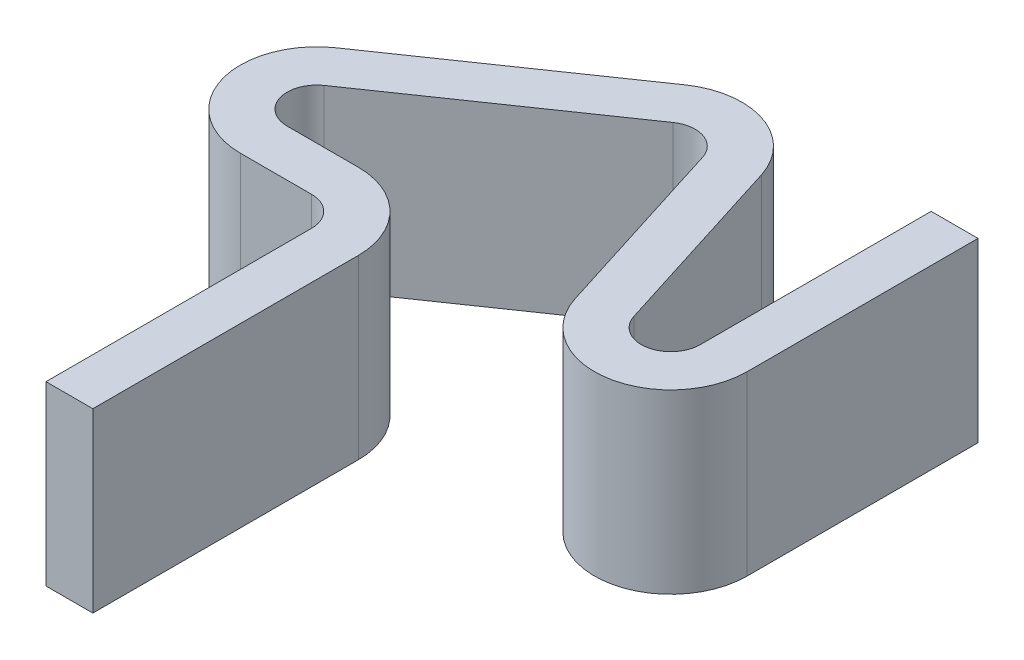
ISO-10303-21;
HEADER;
FILE_DESCRIPTION(('STEP AP214'),'2;1');
FILE_NAME('part.step','',(''),(''),'','','');
FILE_SCHEMA(('AUTOMOTIVE_DESIGN { 1 0 10303 214 1 1 1 1 }'));
ENDSEC;
DATA;
#1=APPLICATION_CONTEXT('core data for automotive mechanical design processes');
#2=APPLICATION_PROTOCOL_DEFINITION('international standard','automotive_design',2000,#1);
#3=PRODUCT_CONTEXT('',#1,'mechanical');
#4=PRODUCT('Part','Part','',(#3));
#5=PRODUCT_RELATED_PRODUCT_CATEGORY('part','',(#4));
#6=PRODUCT_DEFINITION_FORMATION('','',#4);
#7=PRODUCT_DEFINITION_CONTEXT('part definition',#1,'design');
#8=PRODUCT_DEFINITION('design','',#6,#7);
#9=PRODUCT_DEFINITION_SHAPE('','',#8);
#10=(LENGTH_UNIT() NAMED_UNIT(*) SI_UNIT(.MILLI.,.METRE.));
#11=(NAMED_UNIT(*) PLANE_ANGLE_UNIT() SI_UNIT($,.RADIAN.));
#12=(NAMED_UNIT(*) SI_UNIT($,.STERADIAN.) SOLID_ANGLE_UNIT());
#13=UNCERTAINTY_MEASURE_WITH_UNIT(LENGTH_MEASURE(1.E-05),#10,'distance_accuracy_value','');
#14=(GEOMETRIC_REPRESENTATION_CONTEXT(3) GLOBAL_UNCERTAINTY_ASSIGNED_CONTEXT((#13)) GLOBAL_UNIT_ASSIGNED_CONTEXT((#10,
#11,#12)) REPRESENTATION_CONTEXT('',''));
#15=CARTESIAN_POINT('',(0.,0.,0.));
#16=DIRECTION('',(0.,0.,1.));
#17=DIRECTION('',(1.,0.,0.));
#18=AXIS2_PLACEMENT_3D('',#15,#16,#17);
#19=CARTESIAN_POINT('',(0.,1.5,0.));
#20=DIRECTION('',(0.,-1.,0.));
#21=DIRECTION('',(0.,0.,-1.));
#22=AXIS2_PLACEMENT_3D('',#19,#20,#21);
#23=CYLINDRICAL_SURFACE('',#22,1.29375);
#24=CARTESIAN_POINT('',(0.,-1.5,0.));
#25=DIRECTION('',(0.,1.,0.));
#26=DIRECTION('',(0.,0.,1.));
#27=AXIS2_PLACEMENT_3D('',#24,#25,#26);
#28=CIRCLE('',#27,1.29375);
#29=CARTESIAN_POINT('',(1.29375,-1.5,0.));
#30=VERTEX_POINT('',#29);
#31=CARTESIAN_POINT('',(0.,-1.5,-1.29375));
#32=VERTEX_POINT('',#31);
#33=EDGE_CURVE('E212',#30,#32,#28,.T.);
#34=ORIENTED_EDGE('',*,*,#33,.T.);
#35=DIRECTION('',(0.,-1.,0.));
#36=VECTOR('',#35,1.);
#37=CARTESIAN_POINT('',(0.,1.5,-1.29375));
#38=LINE('',#37,#36);
#39=CARTESIAN_POINT('',(0.,1.5,-1.29375));
#40=VERTEX_POINT('',#39);
#41=EDGE_CURVE('E11',#40,#32,#38,.T.);
#42=ORIENTED_EDGE('',*,*,#41,.F.);
#43=CARTESIAN_POINT('',(0.,1.5,0.));
#44=DIRECTION('',(0.,1.,0.));
#45=DIRECTION('',(0.,0.,1.));
#46=AXIS2_PLACEMENT_3D('',#43,#44,#45);
#47=CIRCLE('',#46,1.29375);
#48=CARTESIAN_POINT('',(1.29375,1.5,0.));
#49=VERTEX_POINT('',#48);
#50=EDGE_CURVE('E270',#49,#40,#47,.T.);
#51=ORIENTED_EDGE('',*,*,#50,.F.);
#52=DIRECTION('',(0.,-1.,0.));
#53=VECTOR('',#52,1.);
#54=CARTESIAN_POINT('',(1.29375,1.5,0.));
#55=LINE('',#54,#53);
#56=EDGE_CURVE('E208',#49,#30,#55,.T.);
#57=ORIENTED_EDGE('',*,*,#56,.T.);
#58=EDGE_LOOP('',(#34,#42,#51,#57));
#59=FACE_BOUND('',#58,.T.);
#60=ADVANCED_FACE('F39',(#59),#23,.T.);
#61=CARTESIAN_POINT('',(0.,1.5,-1.29375));
#62=DIRECTION('',(0.,0.,1.));
#63=DIRECTION('',(1.,0.,0.));
#64=AXIS2_PLACEMENT_3D('',#61,#62,#63);
#65=PLANE('',#64);
#66=DIRECTION('',(-1.,0.,0.));
#67=VECTOR('',#66,1.);
#68=CARTESIAN_POINT('',(0.,-1.5,-1.29375));
#69=LINE('',#68,#67);
#70=CARTESIAN_POINT('',(-1.20625,-1.5,-1.29375));
#71=VERTEX_POINT('',#70);
#72=EDGE_CURVE('E216',#32,#71,#69,.T.);
#73=ORIENTED_EDGE('',*,*,#72,.T.);
#74=DIRECTION('',(0.,-1.,0.));
#75=VECTOR('',#74,1.);
#76=CARTESIAN_POINT('',(-1.20625,1.5,-1.29375));
#77=LINE('',#76,#75);
#78=CARTESIAN_POINT('',(-1.20625,1.5,-1.29375));
#79=VERTEX_POINT('',#78);
#80=EDGE_CURVE('E48',#79,#71,#77,.T.);
#81=ORIENTED_EDGE('',*,*,#80,.F.);
#82=DIRECTION('',(-1.,0.,0.));
#83=VECTOR('',#82,1.);
#84=CARTESIAN_POINT('',(0.,1.5,-1.29375));
#85=LINE('',#84,#83);
#86=EDGE_CURVE('E135',#40,#79,#85,.T.);
#87=ORIENTED_EDGE('',*,*,#86,.F.);
#88=ORIENTED_EDGE('',*,*,#41,.T.);
#89=EDGE_LOOP('',(#73,#81,#87,#88));
#90=FACE_BOUND('',#89,.T.);
#91=ADVANCED_FACE('F420',(#90),#65,.F.);
#92=CARTESIAN_POINT('',(-1.20625,1.5,-1.79375));
#93=DIRECTION('',(0.,-1.,0.));
#94=DIRECTION('',(0.,0.,-1.));
#95=AXIS2_PLACEMENT_3D('',#92,#93,#94);
#96=CYLINDRICAL_SURFACE('',#95,0.5);
#97=CARTESIAN_POINT('',(-1.20625,-1.5,-1.79375));
#98=DIRECTION('',(0.,-1.,0.));
#99=DIRECTION('',(0.,0.,-1.));
#100=AXIS2_PLACEMENT_3D('',#97,#98,#99);
#101=CIRCLE('',#100,0.5);
#102=CARTESIAN_POINT('',(-1.49001339561737,-1.5,-2.20542746514438));
#103=VERTEX_POINT('',#102);
#104=EDGE_CURVE('E219',#71,#103,#101,.T.);
#105=ORIENTED_EDGE('',*,*,#104,.T.);
#106=DIRECTION('',(0.,-1.,0.));
#107=VECTOR('',#106,1.);
#108=CARTESIAN_POINT('',(-1.49001339561737,1.5,-2.20542746514438));
#109=LINE('',#108,#107);
#110=CARTESIAN_POINT('',(-1.49001339561737,1.5,-2.20542746514438));
#111=VERTEX_POINT('',#110);
#112=EDGE_CURVE('E329',#111,#103,#109,.T.);
#113=ORIENTED_EDGE('',*,*,#112,.F.);
#114=CARTESIAN_POINT('',(-1.20625,1.5,-1.79375));
#115=DIRECTION('',(0.,-1.,0.));
#116=DIRECTION('',(0.,0.,-1.));
#117=AXIS2_PLACEMENT_3D('',#114,#115,#116);
#118=CIRCLE('',#117,0.5);
#119=EDGE_CURVE('E339',#79,#111,#118,.T.);
#120=ORIENTED_EDGE('',*,*,#119,.F.);
#121=ORIENTED_EDGE('',*,*,#80,.T.);
#122=EDGE_LOOP('',(#105,#113,#120,#121));
#123=FACE_BOUND('',#122,.T.);
#124=ADVANCED_FACE('F337',(#123),#96,.F.);
#125=CARTESIAN_POINT('',(-1.49001339561737,1.5,-2.20542746514438));
#126=DIRECTION('',(-0.567526791234746,0.,-0.82335493028875));
#127=DIRECTION('',(-0.82335493028875,0.,0.567526791234746));
#128=AXIS2_PLACEMENT_3D('',#125,#126,#127);
#129=PLANE('',#128);
#130=DIRECTION('',(0.82335493028875,0.,-0.567526791234746));
#131=VECTOR('',#130,1.);
#132=CARTESIAN_POINT('',(-1.49001339561737,-1.5,-2.20542746514438));
#133=LINE('',#132,#131);
#134=CARTESIAN_POINT('',(2.00998660438263,-1.5,-4.61792746514438));
#135=VERTEX_POINT('',#134);
#136=EDGE_CURVE('E222',#103,#135,#133,.T.);
#137=ORIENTED_EDGE('',*,*,#136,.T.);
#138=DIRECTION('',(0.,-1.,0.));
#139=VECTOR('',#138,1.);
#140=CARTESIAN_POINT('',(2.00998660438263,1.5,-4.61792746514438));
#141=LINE('',#140,#139);
#142=CARTESIAN_POINT('',(2.00998660438263,1.5,-4.61792746514438));
#143=VERTEX_POINT('',#142);
#144=EDGE_CURVE('E325',#143,#135,#141,.T.);
#145=ORIENTED_EDGE('',*,*,#144,.F.);
#146=DIRECTION('',(0.82335493028875,0.,-0.567526791234746));
#147=VECTOR('',#146,1.);
#148=CARTESIAN_POINT('',(-1.49001339561737,1.5,-2.20542746514438));
#149=LINE('',#148,#147);
#150=EDGE_CURVE('E358',#111,#143,#149,.T.);
#151=ORIENTED_EDGE('',*,*,#150,.F.);
#152=ORIENTED_EDGE('',*,*,#112,.T.);
#153=EDGE_LOOP('',(#137,#145,#151,#152));
#154=FACE_BOUND('',#153,.T.);
#155=ADVANCED_FACE('F348',(#154),#129,.F.);
#156=CARTESIAN_POINT('',(2.29375,1.5,-4.20625));
#157=DIRECTION('',(0.,-1.,0.));
#158=DIRECTION('',(0.,0.,-1.));
#159=AXIS2_PLACEMENT_3D('',#156,#157,#158);
#160=CYLINDRICAL_SURFACE('',#159,0.500000000000001);
#161=CARTESIAN_POINT('',(2.29375,-1.5,-4.20625));
#162=DIRECTION('',(0.,-1.,0.));
#163=DIRECTION('',(0.,0.,-1.));
#164=AXIS2_PLACEMENT_3D('',#161,#162,#163);
#165=CIRCLE('',#164,0.500000000000001);
#166=CARTESIAN_POINT('',(2.77058189966681,-1.5,-4.35668716116752));
#167=VERTEX_POINT('',#166);
#168=EDGE_CURVE('E225',#135,#167,#165,.T.);
#169=ORIENTED_EDGE('',*,*,#168,.T.);
#170=DIRECTION('',(0.,-1.,0.));
#171=VECTOR('',#170,1.);
#172=CARTESIAN_POINT('',(2.77058189966681,1.5,-4.35668716116752));
#173=LINE('',#172,#171);
#174=CARTESIAN_POINT('',(2.77058189966681,1.5,-4.35668716116752));
#175=VERTEX_POINT('',#174);
#176=EDGE_CURVE('E321',#175,#167,#173,.T.);
#177=ORIENTED_EDGE('',*,*,#176,.F.);
#178=CARTESIAN_POINT('',(2.29375,1.5,-4.20625));
#179=DIRECTION('',(0.,-1.,0.));
#180=DIRECTION('',(0.,0.,-1.));
#181=AXIS2_PLACEMENT_3D('',#178,#179,#180);
#182=CIRCLE('',#181,0.500000000000001);
#183=EDGE_CURVE('E354',#143,#175,#182,.T.);
#184=ORIENTED_EDGE('',*,*,#183,.F.);
#185=ORIENTED_EDGE('',*,*,#144,.T.);
#186=EDGE_LOOP('',(#169,#177,#184,#185));
#187=FACE_BOUND('',#186,.T.);
#188=ADVANCED_FACE('F352',(#187),#160,.F.);
#189=CARTESIAN_POINT('',(2.77058189966681,1.5,-4.35668716116752));
#190=DIRECTION('',(0.953663799333616,0.,-0.300874322335046));
#191=DIRECTION('',(-0.300874322335046,0.,-0.953663799333616));
#192=AXIS2_PLACEMENT_3D('',#189,#190,#191);
#193=PLANE('',#192);
#194=DIRECTION('',(0.300874322335046,0.,0.953663799333616));
#195=VECTOR('',#194,1.);
#196=CARTESIAN_POINT('',(2.77058189966681,-1.5,-4.35668716116752));
#197=LINE('',#196,#195);
#198=CARTESIAN_POINT('',(3.76704888615141,-1.5,-1.19824384547904));
#199=VERTEX_POINT('',#198);
#200=EDGE_CURVE('E228',#167,#199,#197,.T.);
#201=ORIENTED_EDGE('',*,*,#200,.T.);
#202=DIRECTION('',(0.,-1.,0.));
#203=VECTOR('',#202,1.);
#204=CARTESIAN_POINT('',(3.76704888615141,1.5,-1.19824384547904));
#205=LINE('',#204,#203);
#206=CARTESIAN_POINT('',(3.76704888615141,1.5,-1.19824384547904));
#207=VERTEX_POINT('',#206);
#208=EDGE_CURVE('E317',#207,#199,#205,.T.);
#209=ORIENTED_EDGE('',*,*,#208,.F.);
#210=DIRECTION('',(0.300874322335046,0.,0.953663799333616));
#211=VECTOR('',#210,1.);
#212=CARTESIAN_POINT('',(2.77058189966681,1.5,-4.35668716116752));
#213=LINE('',#212,#211);
#214=EDGE_CURVE('E357',#175,#207,#213,.T.);
#215=ORIENTED_EDGE('',*,*,#214,.F.);
#216=ORIENTED_EDGE('',*,*,#176,.T.);
#217=EDGE_LOOP('',(#201,#209,#215,#216));
#218=FACE_BOUND('',#217,.T.);
#219=ADVANCED_FACE('F433',(#218),#193,.F.);
#220=CARTESIAN_POINT('',(5.00085142653927,1.5,-1.5875));
#221=DIRECTION('',(0.,-1.,0.));
#222=DIRECTION('',(0.,0.,-1.));
#223=AXIS2_PLACEMENT_3D('',#220,#221,#222);
#224=CYLINDRICAL_SURFACE('',#223,1.29375);
#225=CARTESIAN_POINT('',(5.00085142653927,-1.5,-1.5875));
#226=DIRECTION('',(0.,1.,0.));
#227=DIRECTION('',(0.,0.,1.));
#228=AXIS2_PLACEMENT_3D('',#225,#226,#227);
#229=CIRCLE('',#228,1.29375);
#230=CARTESIAN_POINT('',(6.29460142653927,-1.5,-1.5875));
#231=VERTEX_POINT('',#230);
#232=EDGE_CURVE('E231',#199,#231,#229,.T.);
#233=ORIENTED_EDGE('',*,*,#232,.T.);
#234=DIRECTION('',(0.,-1.,0.));
#235=VECTOR('',#234,1.);
#236=CARTESIAN_POINT('',(6.29460142653927,1.5,-1.5875));
#237=LINE('',#236,#235);
#238=CARTESIAN_POINT('',(6.29460142653927,1.5,-1.5875));
#239=VERTEX_POINT('',#238);
#240=EDGE_CURVE('E313',#239,#231,#237,.T.);
#241=ORIENTED_EDGE('',*,*,#240,.F.);
#242=CARTESIAN_POINT('',(5.00085142653927,1.5,-1.5875));
#243=DIRECTION('',(0.,1.,0.));
#244=DIRECTION('',(0.,0.,1.));
#245=AXIS2_PLACEMENT_3D('',#242,#243,#244);
#246=CIRCLE('',#245,1.29375);
#247=EDGE_CURVE('E362',#207,#239,#246,.T.);
#248=ORIENTED_EDGE('',*,*,#247,.F.);
#249=ORIENTED_EDGE('',*,*,#208,.T.);
#250=EDGE_LOOP('',(#233,#241,#248,#249));
#251=FACE_BOUND('',#250,.T.);
#252=ADVANCED_FACE('F436',(#251),#224,.T.);
#253=CARTESIAN_POINT('',(6.29460142653927,1.5,-1.5875));
#254=DIRECTION('',(-1.,0.,0.));
#255=DIRECTION('',(0.,0.,1.));
#256=AXIS2_PLACEMENT_3D('',#253,#254,#255);
#257=PLANE('',#256);
#258=DIRECTION('',(0.,0.,-1.));
#259=VECTOR('',#258,1.);
#260=CARTESIAN_POINT('',(6.29460142653927,-1.5,-1.5875));
#261=LINE('',#260,#259);
#262=CARTESIAN_POINT('',(6.29460142653928,-1.5,-5.5));
#263=VERTEX_POINT('',#262);
#264=EDGE_CURVE('E234',#231,#263,#261,.T.);
#265=ORIENTED_EDGE('',*,*,#264,.T.);
#266=DIRECTION('',(0.,-1.,0.));
#267=VECTOR('',#266,1.);
#268=CARTESIAN_POINT('',(6.29460142653928,1.5,-5.5));
#269=LINE('',#268,#267);
#270=CARTESIAN_POINT('',(6.29460142653928,1.5,-5.5));
#271=VERTEX_POINT('',#270);
#272=EDGE_CURVE('E309',#271,#263,#269,.T.);
#273=ORIENTED_EDGE('',*,*,#272,.F.);
#274=DIRECTION('',(0.,0.,-1.));
#275=VECTOR('',#274,1.);
#276=CARTESIAN_POINT('',(6.29460142653927,1.5,-1.5875));
#277=LINE('',#276,#275);
#278=EDGE_CURVE('E369',#239,#271,#277,.T.);
#279=ORIENTED_EDGE('',*,*,#278,.F.);
#280=ORIENTED_EDGE('',*,*,#240,.T.);
#281=EDGE_LOOP('',(#265,#273,#279,#280));
#282=FACE_BOUND('',#281,.T.);
#283=ADVANCED_FACE('F440',(#282),#257,.F.);
#284=CARTESIAN_POINT('',(5.50085142653927,1.5,-5.5));
#285=DIRECTION('',(0.,0.,1.));
#286=DIRECTION('',(1.,0.,0.));
#287=AXIS2_PLACEMENT_3D('',#284,#285,#286);
#288=PLANE('',#287);
#289=DIRECTION('',(-1.,0.,0.));
#290=VECTOR('',#289,1.);
#291=CARTESIAN_POINT('',(5.50085142653927,-1.5,-5.5));
#292=LINE('',#291,#290);
#293=CARTESIAN_POINT('',(5.50085142653927,-1.5,-5.5));
#294=VERTEX_POINT('',#293);
#295=EDGE_CURVE('E237',#263,#294,#292,.T.);
#296=ORIENTED_EDGE('',*,*,#295,.T.);
#297=DIRECTION('',(0.,-1.,0.));
#298=VECTOR('',#297,1.);
#299=CARTESIAN_POINT('',(5.50085142653927,1.5,-5.5));
#300=LINE('',#299,#298);
#301=CARTESIAN_POINT('',(5.50085142653927,1.5,-5.5));
#302=VERTEX_POINT('',#301);
#303=EDGE_CURVE('E305',#302,#294,#300,.T.);
#304=ORIENTED_EDGE('',*,*,#303,.F.);
#305=DIRECTION('',(-1.,0.,0.));
#306=VECTOR('',#305,1.);
#307=CARTESIAN_POINT('',(5.50085142653927,1.5,-5.5));
#308=LINE('',#307,#306);
#309=EDGE_CURVE('E372',#271,#302,#308,.T.);
#310=ORIENTED_EDGE('',*,*,#309,.F.);
#311=ORIENTED_EDGE('',*,*,#272,.T.);
#312=EDGE_LOOP('',(#296,#304,#310,#311));
#313=FACE_BOUND('',#312,.T.);
#314=ADVANCED_FACE('F444',(#313),#288,.F.);
#315=CARTESIAN_POINT('',(5.50085142653927,1.5,-1.5875));
#316=DIRECTION('',(1.,0.,0.));
#317=DIRECTION('',(0.,0.,-1.));
#318=AXIS2_PLACEMENT_3D('',#315,#316,#317);
#319=PLANE('',#318);
#320=DIRECTION('',(0.,0.,1.));
#321=VECTOR('',#320,1.);
#322=CARTESIAN_POINT('',(5.50085142653927,-1.5,-1.5875));
#323=LINE('',#322,#321);
#324=CARTESIAN_POINT('',(5.50085142653927,-1.5,-1.5875));
#325=VERTEX_POINT('',#324);
#326=EDGE_CURVE('E240',#294,#325,#323,.T.);
#327=ORIENTED_EDGE('',*,*,#326,.T.);
#328=DIRECTION('',(0.,-1.,0.));
#329=VECTOR('',#328,1.);
#330=CARTESIAN_POINT('',(5.50085142653927,1.5,-1.5875));
#331=LINE('',#330,#329);
#332=CARTESIAN_POINT('',(5.50085142653927,1.5,-1.5875));
#333=VERTEX_POINT('',#332);
#334=EDGE_CURVE('E301',#333,#325,#331,.T.);
#335=ORIENTED_EDGE('',*,*,#334,.F.);
#336=DIRECTION('',(0.,0.,1.));
#337=VECTOR('',#336,1.);
#338=CARTESIAN_POINT('',(5.50085142653927,1.5,-1.5875));
#339=LINE('',#338,#337);
#340=EDGE_CURVE('E375',#302,#333,#339,.T.);
#341=ORIENTED_EDGE('',*,*,#340,.F.);
#342=ORIENTED_EDGE('',*,*,#303,.T.);
#343=EDGE_LOOP('',(#327,#335,#341,#342));
#344=FACE_BOUND('',#343,.T.);
#345=ADVANCED_FACE('F448',(#344),#319,.F.);
#346=CARTESIAN_POINT('',(5.00085142653927,1.5,-1.5875));
#347=DIRECTION('',(0.,-1.,0.));
#348=DIRECTION('',(0.,0.,-1.));
#349=AXIS2_PLACEMENT_3D('',#346,#347,#348);
#350=CYLINDRICAL_SURFACE('',#349,0.500000000000002);
#351=CARTESIAN_POINT('',(5.00085142653927,-1.5,-1.5875));
#352=DIRECTION('',(0.,-1.,0.));
#353=DIRECTION('',(0.,0.,1.));
#354=AXIS2_PLACEMENT_3D('',#351,#352,#353);
#355=CIRCLE('',#354,0.500000000000002);
#356=CARTESIAN_POINT('',(4.52401952687246,-1.5,-1.43706283883248));
#357=VERTEX_POINT('',#356);
#358=EDGE_CURVE('E243',#325,#357,#355,.T.);
#359=ORIENTED_EDGE('',*,*,#358,.T.);
#360=DIRECTION('',(0.,-1.,0.));
#361=VECTOR('',#360,1.);
#362=CARTESIAN_POINT('',(4.52401952687246,1.5,-1.43706283883248));
#363=LINE('',#362,#361);
#364=CARTESIAN_POINT('',(4.52401952687246,1.5,-1.43706283883248));
#365=VERTEX_POINT('',#364);
#366=EDGE_CURVE('E297',#365,#357,#363,.T.);
#367=ORIENTED_EDGE('',*,*,#366,.F.);
#368=CARTESIAN_POINT('',(5.00085142653927,1.5,-1.5875));
#369=DIRECTION('',(0.,-1.,0.));
#370=DIRECTION('',(0.,0.,1.));
#371=AXIS2_PLACEMENT_3D('',#368,#369,#370);
#372=CIRCLE('',#371,0.500000000000002);
#373=EDGE_CURVE('E378',#333,#365,#372,.T.);
#374=ORIENTED_EDGE('',*,*,#373,.F.);
#375=ORIENTED_EDGE('',*,*,#334,.T.);
#376=EDGE_LOOP('',(#359,#367,#374,#375));
#377=FACE_BOUND('',#376,.T.);
#378=ADVANCED_FACE('F452',(#377),#350,.F.);
#379=CARTESIAN_POINT('',(3.52755254038787,1.5,-4.59550615452097));
#380=DIRECTION('',(-0.953663799333616,0.,0.300874322335043));
#381=DIRECTION('',(0.300874322335043,0.,0.953663799333617));
#382=AXIS2_PLACEMENT_3D('',#379,#380,#381);
#383=PLANE('',#382);
#384=DIRECTION('',(-0.300874322335043,0.,-0.953663799333616));
#385=VECTOR('',#384,1.);
#386=CARTESIAN_POINT('',(3.52755254038787,-1.5,-4.59550615452097));
#387=LINE('',#386,#385);
#388=CARTESIAN_POINT('',(3.52755254038787,-1.5,-4.59550615452097));
#389=VERTEX_POINT('',#388);
#390=EDGE_CURVE('E246',#357,#389,#387,.T.);
#391=ORIENTED_EDGE('',*,*,#390,.T.);
#392=DIRECTION('',(0.,-1.,0.));
#393=VECTOR('',#392,1.);
#394=CARTESIAN_POINT('',(3.52755254038787,1.5,-4.59550615452097));
#395=LINE('',#394,#393);
#396=CARTESIAN_POINT('',(3.52755254038787,1.5,-4.59550615452097));
#397=VERTEX_POINT('',#396);
#398=EDGE_CURVE('E293',#397,#389,#395,.T.);
#399=ORIENTED_EDGE('',*,*,#398,.F.);
#400=DIRECTION('',(-0.300874322335043,0.,-0.953663799333616));
#401=VECTOR('',#400,1.);
#402=CARTESIAN_POINT('',(3.52755254038787,1.5,-4.59550615452097));
#403=LINE('',#402,#401);
#404=EDGE_CURVE('E381',#365,#397,#403,.T.);
#405=ORIENTED_EDGE('',*,*,#404,.F.);
#406=ORIENTED_EDGE('',*,*,#366,.T.);
#407=EDGE_LOOP('',(#391,#399,#405,#406));
#408=FACE_BOUND('',#407,.T.);
#409=ADVANCED_FACE('F456',(#408),#383,.F.);
#410=CARTESIAN_POINT('',(2.29375,1.5,-4.20625));
#411=DIRECTION('',(0.,-1.,0.));
#412=DIRECTION('',(0.,0.,-1.));
#413=AXIS2_PLACEMENT_3D('',#410,#411,#412);
#414=CYLINDRICAL_SURFACE('',#413,1.29375);
#415=CARTESIAN_POINT('',(2.29375,-1.5,-4.20625));
#416=DIRECTION('',(0.,1.,0.));
#417=DIRECTION('',(0.,0.,-1.));
#418=AXIS2_PLACEMENT_3D('',#415,#416,#417);
#419=CIRCLE('',#418,1.29375);
#420=CARTESIAN_POINT('',(1.55951221384005,-1.5,-5.27146544106107));
#421=VERTEX_POINT('',#420);
#422=EDGE_CURVE('E249',#389,#421,#419,.T.);
#423=ORIENTED_EDGE('',*,*,#422,.T.);
#424=DIRECTION('',(0.,-1.,0.));
#425=VECTOR('',#424,1.);
#426=CARTESIAN_POINT('',(1.55951221384005,1.5,-5.27146544106107));
#427=LINE('',#426,#425);
#428=CARTESIAN_POINT('',(1.55951221384005,1.5,-5.27146544106107));
#429=VERTEX_POINT('',#428);
#430=EDGE_CURVE('E289',#429,#421,#427,.T.);
#431=ORIENTED_EDGE('',*,*,#430,.F.);
#432=CARTESIAN_POINT('',(2.29375,1.5,-4.20625));
#433=DIRECTION('',(0.,1.,0.));
#434=DIRECTION('',(0.,0.,-1.));
#435=AXIS2_PLACEMENT_3D('',#432,#433,#434);
#436=CIRCLE('',#435,1.29375);
#437=EDGE_CURVE('E384',#397,#429,#436,.T.);
#438=ORIENTED_EDGE('',*,*,#437,.F.);
#439=ORIENTED_EDGE('',*,*,#398,.T.);
#440=EDGE_LOOP('',(#423,#431,#438,#439));
#441=FACE_BOUND('',#440,.T.);
#442=ADVANCED_FACE('F460',(#441),#414,.T.);
#443=CARTESIAN_POINT('',(-1.94048778615995,1.5,-2.85896544106107));
#444=DIRECTION('',(0.567526791234746,0.,0.82335493028875));
#445=DIRECTION('',(0.82335493028875,0.,-0.567526791234746));
#446=AXIS2_PLACEMENT_3D('',#443,#444,#445);
#447=PLANE('',#446);
#448=DIRECTION('',(-0.82335493028875,0.,0.567526791234746));
#449=VECTOR('',#448,1.);
#450=CARTESIAN_POINT('',(-1.94048778615995,-1.5,-2.85896544106107));
#451=LINE('',#450,#449);
#452=CARTESIAN_POINT('',(-1.94048778615995,-1.5,-2.85896544106107));
#453=VERTEX_POINT('',#452);
#454=EDGE_CURVE('E252',#421,#453,#451,.T.);
#455=ORIENTED_EDGE('',*,*,#454,.T.);
#456=DIRECTION('',(0.,-1.,0.));
#457=VECTOR('',#456,1.);
#458=CARTESIAN_POINT('',(-1.94048778615995,1.5,-2.85896544106107));
#459=LINE('',#458,#457);
#460=CARTESIAN_POINT('',(-1.94048778615995,1.5,-2.85896544106107));
#461=VERTEX_POINT('',#460);
#462=EDGE_CURVE('E285',#461,#453,#459,.T.);
#463=ORIENTED_EDGE('',*,*,#462,.F.);
#464=DIRECTION('',(-0.82335493028875,0.,0.567526791234746));
#465=VECTOR('',#464,1.);
#466=CARTESIAN_POINT('',(-1.94048778615995,1.5,-2.85896544106107));
#467=LINE('',#466,#465);
#468=EDGE_CURVE('E387',#429,#461,#467,.T.);
#469=ORIENTED_EDGE('',*,*,#468,.F.);
#470=ORIENTED_EDGE('',*,*,#430,.T.);
#471=EDGE_LOOP('',(#455,#463,#469,#470));
#472=FACE_BOUND('',#471,.T.);
#473=ADVANCED_FACE('F464',(#472),#447,.F.);
#474=CARTESIAN_POINT('',(-1.20625,1.5,-1.79375));
#475=DIRECTION('',(0.,-1.,0.));
#476=DIRECTION('',(0.,0.,-1.));
#477=AXIS2_PLACEMENT_3D('',#474,#475,#476);
#478=CYLINDRICAL_SURFACE('',#477,1.29375);
#479=CARTESIAN_POINT('',(-1.20625,-1.5,-1.79375));
#480=DIRECTION('',(0.,1.,0.));
#481=DIRECTION('',(0.,0.,-1.));
#482=AXIS2_PLACEMENT_3D('',#479,#480,#481);
#483=CIRCLE('',#482,1.29375);
#484=CARTESIAN_POINT('',(-1.20625,-1.5,-0.5));
#485=VERTEX_POINT('',#484);
#486=EDGE_CURVE('E255',#453,#485,#483,.T.);
#487=ORIENTED_EDGE('',*,*,#486,.T.);
#488=DIRECTION('',(0.,-1.,0.));
#489=VECTOR('',#488,1.);
#490=CARTESIAN_POINT('',(-1.20625,1.5,-0.5));
#491=LINE('',#490,#489);
#492=CARTESIAN_POINT('',(-1.20625,1.5,-0.5));
#493=VERTEX_POINT('',#492);
#494=EDGE_CURVE('E281',#493,#485,#491,.T.);
#495=ORIENTED_EDGE('',*,*,#494,.F.);
#496=CARTESIAN_POINT('',(-1.20625,1.5,-1.79375));
#497=DIRECTION('',(0.,1.,0.));
#498=DIRECTION('',(0.,0.,-1.));
#499=AXIS2_PLACEMENT_3D('',#496,#497,#498);
#500=CIRCLE('',#499,1.29375);
#501=EDGE_CURVE('E390',#461,#493,#500,.T.);
#502=ORIENTED_EDGE('',*,*,#501,.F.);
#503=ORIENTED_EDGE('',*,*,#462,.T.);
#504=EDGE_LOOP('',(#487,#495,#502,#503));
#505=FACE_BOUND('',#504,.T.);
#506=ADVANCED_FACE('F468',(#505),#478,.T.);
#507=CARTESIAN_POINT('',(0.,1.5,-0.5));
#508=DIRECTION('',(0.,0.,-1.));
#509=DIRECTION('',(-1.,0.,0.));
#510=AXIS2_PLACEMENT_3D('',#507,#508,#509);
#511=PLANE('',#510);
#512=DIRECTION('',(1.,0.,0.));
#513=VECTOR('',#512,1.);
#514=CARTESIAN_POINT('',(0.,-1.5,-0.5));
#515=LINE('',#514,#513);
#516=CARTESIAN_POINT('',(0.,-1.5,-0.5));
#517=VERTEX_POINT('',#516);
#518=EDGE_CURVE('E258',#485,#517,#515,.T.);
#519=ORIENTED_EDGE('',*,*,#518,.T.);
#520=DIRECTION('',(0.,-1.,0.));
#521=VECTOR('',#520,1.);
#522=CARTESIAN_POINT('',(0.,1.5,-0.5));
#523=LINE('',#522,#521);
#524=CARTESIAN_POINT('',(0.,1.5,-0.5));
#525=VERTEX_POINT('',#524);
#526=EDGE_CURVE('E277',#525,#517,#523,.T.);
#527=ORIENTED_EDGE('',*,*,#526,.F.);
#528=DIRECTION('',(1.,0.,0.));
#529=VECTOR('',#528,1.);
#530=CARTESIAN_POINT('',(0.,1.5,-0.5));
#531=LINE('',#530,#529);
#532=EDGE_CURVE('E393',#493,#525,#531,.T.);
#533=ORIENTED_EDGE('',*,*,#532,.F.);
#534=ORIENTED_EDGE('',*,*,#494,.T.);
#535=EDGE_LOOP('',(#519,#527,#533,#534));
#536=FACE_BOUND('',#535,.T.);
#537=ADVANCED_FACE('F401',(#536),#511,.F.);
#538=CARTESIAN_POINT('',(0.,1.5,0.));
#539=DIRECTION('',(0.,-1.,0.));
#540=DIRECTION('',(0.,0.,-1.));
#541=AXIS2_PLACEMENT_3D('',#538,#539,#540);
#542=CYLINDRICAL_SURFACE('',#541,0.5);
#543=CARTESIAN_POINT('',(0.,-1.5,0.));
#544=DIRECTION('',(0.,-1.,0.));
#545=DIRECTION('',(0.,0.,1.));
#546=AXIS2_PLACEMENT_3D('',#543,#544,#545);
#547=CIRCLE('',#546,0.5);
#548=CARTESIAN_POINT('',(0.5,-1.5,0.));
#549=VERTEX_POINT('',#548);
#550=EDGE_CURVE('E261',#517,#549,#547,.T.);
#551=ORIENTED_EDGE('',*,*,#550,.T.);
#552=DIRECTION('',(0.,-1.,0.));
#553=VECTOR('',#552,1.);
#554=CARTESIAN_POINT('',(0.5,1.5,0.));
#555=LINE('',#554,#553);
#556=CARTESIAN_POINT('',(0.5,1.5,0.));
#557=VERTEX_POINT('',#556);
#558=EDGE_CURVE('E201',#557,#549,#555,.T.);
#559=ORIENTED_EDGE('',*,*,#558,.F.);
#560=CARTESIAN_POINT('',(0.,1.5,0.));
#561=DIRECTION('',(0.,-1.,0.));
#562=DIRECTION('',(0.,0.,1.));
#563=AXIS2_PLACEMENT_3D('',#560,#561,#562);
#564=CIRCLE('',#563,0.5);
#565=EDGE_CURVE('E190',#525,#557,#564,.T.);
#566=ORIENTED_EDGE('',*,*,#565,.F.);
#567=ORIENTED_EDGE('',*,*,#526,.T.);
#568=EDGE_LOOP('',(#551,#559,#566,#567));
#569=FACE_BOUND('',#568,.T.);
#570=ADVANCED_FACE('F405',(#569),#542,.F.);
#571=CARTESIAN_POINT('',(0.5,1.5,0.));
#572=DIRECTION('',(1.,0.,0.));
#573=DIRECTION('',(0.,0.,-1.));
#574=AXIS2_PLACEMENT_3D('',#571,#572,#573);
#575=PLANE('',#574);
#576=DIRECTION('',(0.,0.,1.));
#577=VECTOR('',#576,1.);
#578=CARTESIAN_POINT('',(0.5,-1.5,0.));
#579=LINE('',#578,#577);
#580=CARTESIAN_POINT('',(0.5,-1.5,4.5));
#581=VERTEX_POINT('',#580);
#582=EDGE_CURVE('E199',#549,#581,#579,.T.);
#583=ORIENTED_EDGE('',*,*,#582,.T.);
#584=DIRECTION('',(0.,-1.,0.));
#585=VECTOR('',#584,1.);
#586=CARTESIAN_POINT('',(0.5,1.5,4.5));
#587=LINE('',#586,#585);
#588=CARTESIAN_POINT('',(0.5,1.5,4.5));
#589=VERTEX_POINT('',#588);
#590=EDGE_CURVE('E196',#589,#581,#587,.T.);
#591=ORIENTED_EDGE('',*,*,#590,.F.);
#592=DIRECTION('',(0.,0.,1.));
#593=VECTOR('',#592,1.);
#594=CARTESIAN_POINT('',(0.5,1.5,0.));
#595=LINE('',#594,#593);
#596=EDGE_CURVE('E184',#557,#589,#595,.T.);
#597=ORIENTED_EDGE('',*,*,#596,.F.);
#598=ORIENTED_EDGE('',*,*,#558,.T.);
#599=EDGE_LOOP('',(#583,#591,#597,#598));
#600=FACE_BOUND('',#599,.T.);
#601=ADVANCED_FACE('F197',(#600),#575,.F.);
#602=CARTESIAN_POINT('',(0.5,1.5,4.5));
#603=DIRECTION('',(0.,0.,-1.));
#604=DIRECTION('',(-1.,0.,0.));
#605=AXIS2_PLACEMENT_3D('',#602,#603,#604);
#606=PLANE('',#605);
#607=DIRECTION('',(1.,0.,0.));
#608=VECTOR('',#607,1.);
#609=CARTESIAN_POINT('',(0.5,-1.5,4.5));
#610=LINE('',#609,#608);
#611=CARTESIAN_POINT('',(1.29375,-1.5,4.5));
#612=VERTEX_POINT('',#611);
#613=EDGE_CURVE('E121',#581,#612,#610,.T.);
#614=ORIENTED_EDGE('',*,*,#613,.T.);
#615=DIRECTION('',(0.,-1.,0.));
#616=VECTOR('',#615,1.);
#617=CARTESIAN_POINT('',(1.29375,1.5,4.5));
#618=LINE('',#617,#616);
#619=CARTESIAN_POINT('',(1.29375,1.5,4.5));
#620=VERTEX_POINT('',#619);
#621=EDGE_CURVE('E202',#620,#612,#618,.T.);
#622=ORIENTED_EDGE('',*,*,#621,.F.);
#623=DIRECTION('',(1.,0.,0.));
#624=VECTOR('',#623,1.);
#625=CARTESIAN_POINT('',(0.5,1.5,4.5));
#626=LINE('',#625,#624);
#627=EDGE_CURVE('E188',#589,#620,#626,.T.);
#628=ORIENTED_EDGE('',*,*,#627,.F.);
#629=ORIENTED_EDGE('',*,*,#590,.T.);
#630=EDGE_LOOP('',(#614,#622,#628,#629));
#631=FACE_BOUND('',#630,.T.);
#632=ADVANCED_FACE('F204',(#631),#606,.F.);
#633=CARTESIAN_POINT('',(1.29375,1.5,0.));
#634=DIRECTION('',(-1.,0.,0.));
#635=DIRECTION('',(0.,0.,1.));
#636=AXIS2_PLACEMENT_3D('',#633,#634,#635);
#637=PLANE('',#636);
#638=DIRECTION('',(0.,0.,-1.));
#639=VECTOR('',#638,1.);
#640=CARTESIAN_POINT('',(1.29375,-1.5,0.));
#641=LINE('',#640,#639);
#642=EDGE_CURVE('E127',#612,#30,#641,.T.);
#643=ORIENTED_EDGE('',*,*,#642,.T.);
#644=ORIENTED_EDGE('',*,*,#56,.F.);
#645=DIRECTION('',(0.,0.,-1.));
#646=VECTOR('',#645,1.);
#647=CARTESIAN_POINT('',(1.29375,1.5,0.));
#648=LINE('',#647,#646);
#649=EDGE_CURVE('E56',#620,#49,#648,.T.);
#650=ORIENTED_EDGE('',*,*,#649,.F.);
#651=ORIENTED_EDGE('',*,*,#621,.T.);
#652=EDGE_LOOP('',(#643,#644,#650,#651));
#653=FACE_BOUND('',#652,.T.);
#654=ADVANCED_FACE('F409',(#653),#637,.F.);
#655=CARTESIAN_POINT('',(0.,1.5,0.));
#656=DIRECTION('',(0.,1.,0.));
#657=DIRECTION('',(0.,0.,1.));
#658=AXIS2_PLACEMENT_3D('',#655,#656,#657);
#659=PLANE('',#658);
#660=ORIENTED_EDGE('',*,*,#50,.T.);
#661=ORIENTED_EDGE('',*,*,#86,.T.);
#662=ORIENTED_EDGE('',*,*,#119,.T.);
#663=ORIENTED_EDGE('',*,*,#150,.T.);
#664=ORIENTED_EDGE('',*,*,#183,.T.);
#665=ORIENTED_EDGE('',*,*,#214,.T.);
#666=ORIENTED_EDGE('',*,*,#247,.T.);
#667=ORIENTED_EDGE('',*,*,#278,.T.);
#668=ORIENTED_EDGE('',*,*,#309,.T.);
#669=ORIENTED_EDGE('',*,*,#340,.T.);
#670=ORIENTED_EDGE('',*,*,#373,.T.);
#671=ORIENTED_EDGE('',*,*,#404,.T.);
#672=ORIENTED_EDGE('',*,*,#437,.T.);
#673=ORIENTED_EDGE('',*,*,#468,.T.);
#674=ORIENTED_EDGE('',*,*,#501,.T.);
#675=ORIENTED_EDGE('',*,*,#532,.T.);
#676=ORIENTED_EDGE('',*,*,#565,.T.);
#677=ORIENTED_EDGE('',*,*,#596,.T.);
#678=ORIENTED_EDGE('',*,*,#627,.T.);
#679=ORIENTED_EDGE('',*,*,#649,.T.);
#680=EDGE_LOOP('',(#660,#661,#662,#663,#664,#665,#666,#667,#668,#669,#670,#671,#672,#673,#674,
#675,#676,#677,#678,#679));
#681=FACE_BOUND('',#680,.T.);
#682=ADVANCED_FACE('F186',(#681),#659,.T.);
#683=CARTESIAN_POINT('',(0.,-1.5,0.));
#684=DIRECTION('',(0.,1.,0.));
#685=DIRECTION('',(0.,0.,1.));
#686=AXIS2_PLACEMENT_3D('',#683,#684,#685);
#687=PLANE('',#686);
#688=ORIENTED_EDGE('',*,*,#33,.F.);
#689=ORIENTED_EDGE('',*,*,#642,.F.);
#690=ORIENTED_EDGE('',*,*,#613,.F.);
#691=ORIENTED_EDGE('',*,*,#582,.F.);
#692=ORIENTED_EDGE('',*,*,#550,.F.);
#693=ORIENTED_EDGE('',*,*,#518,.F.);
#694=ORIENTED_EDGE('',*,*,#486,.F.);
#695=ORIENTED_EDGE('',*,*,#454,.F.);
#696=ORIENTED_EDGE('',*,*,#422,.F.);
#697=ORIENTED_EDGE('',*,*,#390,.F.);
#698=ORIENTED_EDGE('',*,*,#358,.F.);
#699=ORIENTED_EDGE('',*,*,#326,.F.);
#700=ORIENTED_EDGE('',*,*,#295,.F.);
#701=ORIENTED_EDGE('',*,*,#264,.F.);
#702=ORIENTED_EDGE('',*,*,#232,.F.);
#703=ORIENTED_EDGE('',*,*,#200,.F.);
#704=ORIENTED_EDGE('',*,*,#168,.F.);
#705=ORIENTED_EDGE('',*,*,#136,.F.);
#706=ORIENTED_EDGE('',*,*,#104,.F.);
#707=ORIENTED_EDGE('',*,*,#72,.F.);
#708=EDGE_LOOP('',(#688,#689,#690,#691,#692,#693,#694,#695,#696,#697,#698,#699,#700,#701,#702,
#703,#704,#705,#706,#707));
#709=FACE_BOUND('',#708,.T.);
#710=ADVANCED_FACE('F343',(#709),#687,.F.);
#711=CLOSED_SHELL('',(#60,#91,#124,#155,#188,#219,#252,#283,#314,#345,#378,#409,#442,#473,#506,
#537,#570,#601,#632,#654,#682,#710));
#712=MANIFOLD_SOLID_BREP('B2',#711);
#713=ADVANCED_BREP_SHAPE_REPRESENTATION('',(#18,#712),#14);
#714=SHAPE_DEFINITION_REPRESENTATION(#9,#713);
ENDSEC;
END-ISO-10303-21;
